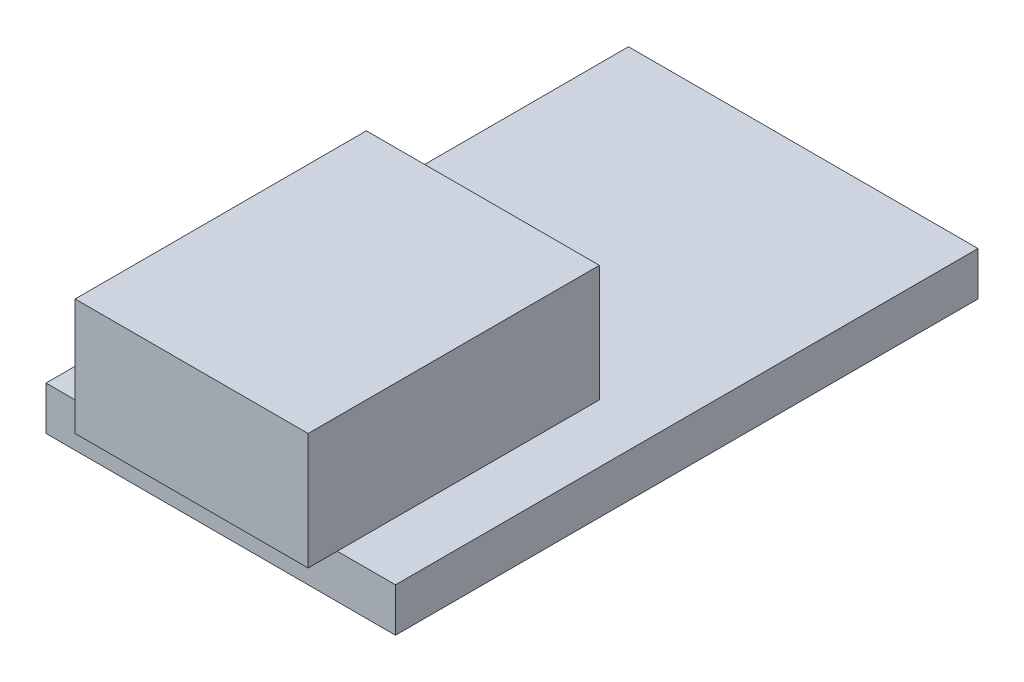
ISO-10303-21;
HEADER;
FILE_DESCRIPTION(('STEP AP214'),'2;1');
FILE_NAME('part.step','',(''),(''),'','','');
FILE_SCHEMA(('AUTOMOTIVE_DESIGN { 1 0 10303 214 1 1 1 1 }'));
ENDSEC;
DATA;
#1=APPLICATION_CONTEXT('core data for automotive mechanical design processes');
#2=APPLICATION_PROTOCOL_DEFINITION('international standard','automotive_design',2000,#1);
#3=PRODUCT_CONTEXT('',#1,'mechanical');
#4=PRODUCT('Part','Part','',(#3));
#5=PRODUCT_RELATED_PRODUCT_CATEGORY('part','',(#4));
#6=PRODUCT_DEFINITION_FORMATION('','',#4);
#7=PRODUCT_DEFINITION_CONTEXT('part definition',#1,'design');
#8=PRODUCT_DEFINITION('design','',#6,#7);
#9=PRODUCT_DEFINITION_SHAPE('','',#8);
#10=(LENGTH_UNIT() NAMED_UNIT(*) SI_UNIT(.MILLI.,.METRE.));
#11=(NAMED_UNIT(*) PLANE_ANGLE_UNIT() SI_UNIT($,.RADIAN.));
#12=(NAMED_UNIT(*) SI_UNIT($,.STERADIAN.) SOLID_ANGLE_UNIT());
#13=UNCERTAINTY_MEASURE_WITH_UNIT(LENGTH_MEASURE(1.E-05),#10,'distance_accuracy_value','');
#14=(GEOMETRIC_REPRESENTATION_CONTEXT(3) GLOBAL_UNCERTAINTY_ASSIGNED_CONTEXT((#13)) GLOBAL_UNIT_ASSIGNED_CONTEXT((#10,
#11,#12)) REPRESENTATION_CONTEXT('',''));
#15=CARTESIAN_POINT('',(0.,0.,0.));
#16=DIRECTION('',(0.,0.,1.));
#17=DIRECTION('',(1.,0.,0.));
#18=AXIS2_PLACEMENT_3D('',#15,#16,#17);
#19=CARTESIAN_POINT('',(4.,4.,5.));
#20=DIRECTION('',(-1.,0.,0.));
#21=DIRECTION('',(0.,0.,1.));
#22=AXIS2_PLACEMENT_3D('',#19,#20,#21);
#23=PLANE('',#22);
#24=DIRECTION('',(0.,0.,-1.));
#25=VECTOR('',#24,1.);
#26=CARTESIAN_POINT('',(4.,0.,5.));
#27=LINE('',#26,#25);
#28=CARTESIAN_POINT('',(4.,0.,5.));
#29=VERTEX_POINT('',#28);
#30=CARTESIAN_POINT('',(4.,0.,4.));
#31=VERTEX_POINT('',#30);
#32=EDGE_CURVE('E144',#29,#31,#27,.T.);
#33=ORIENTED_EDGE('',*,*,#32,.T.);
#34=CARTESIAN_POINT('',(4.,0.,-5.));
#35=VERTEX_POINT('',#34);
#36=EDGE_CURVE('E142',#31,#35,#27,.T.);
#37=ORIENTED_EDGE('',*,*,#36,.T.);
#38=DIRECTION('',(0.,-1.,0.));
#39=VECTOR('',#38,1.);
#40=CARTESIAN_POINT('',(4.,4.,-5.));
#41=LINE('',#40,#39);
#42=CARTESIAN_POINT('',(4.,4.,-5.));
#43=VERTEX_POINT('',#42);
#44=EDGE_CURVE('E36',#43,#35,#41,.T.);
#45=ORIENTED_EDGE('',*,*,#44,.F.);
#46=DIRECTION('',(0.,0.,-1.));
#47=VECTOR('',#46,1.);
#48=CARTESIAN_POINT('',(4.,4.,5.));
#49=LINE('',#48,#47);
#50=CARTESIAN_POINT('',(4.,4.,5.));
#51=VERTEX_POINT('',#50);
#52=EDGE_CURVE('E150',#51,#43,#49,.T.);
#53=ORIENTED_EDGE('',*,*,#52,.F.);
#54=DIRECTION('',(0.,-1.,0.));
#55=VECTOR('',#54,1.);
#56=CARTESIAN_POINT('',(4.,4.,5.));
#57=LINE('',#56,#55);
#58=EDGE_CURVE('E155',#51,#29,#57,.T.);
#59=ORIENTED_EDGE('',*,*,#58,.T.);
#60=EDGE_LOOP('',(#33,#37,#45,#53,#59));
#61=FACE_BOUND('',#60,.T.);
#62=ADVANCED_FACE('F33',(#61),#23,.F.);
#63=CARTESIAN_POINT('',(-4.,4.,-5.));
#64=DIRECTION('',(0.,0.,1.));
#65=DIRECTION('',(1.,0.,0.));
#66=AXIS2_PLACEMENT_3D('',#63,#64,#65);
#67=PLANE('',#66);
#68=DIRECTION('',(-1.,0.,0.));
#69=VECTOR('',#68,1.);
#70=CARTESIAN_POINT('',(-4.,0.,-5.));
#71=LINE('',#70,#69);
#72=CARTESIAN_POINT('',(-4.,0.,-5.));
#73=VERTEX_POINT('',#72);
#74=EDGE_CURVE('E157',#35,#73,#71,.T.);
#75=ORIENTED_EDGE('',*,*,#74,.T.);
#76=DIRECTION('',(0.,-1.,0.));
#77=VECTOR('',#76,1.);
#78=CARTESIAN_POINT('',(-4.,4.,-5.));
#79=LINE('',#78,#77);
#80=CARTESIAN_POINT('',(-4.,4.,-5.));
#81=VERTEX_POINT('',#80);
#82=EDGE_CURVE('E165',#81,#73,#79,.T.);
#83=ORIENTED_EDGE('',*,*,#82,.F.);
#84=DIRECTION('',(-1.,0.,0.));
#85=VECTOR('',#84,1.);
#86=CARTESIAN_POINT('',(-4.,4.,-5.));
#87=LINE('',#86,#85);
#88=EDGE_CURVE('E86',#43,#81,#87,.T.);
#89=ORIENTED_EDGE('',*,*,#88,.F.);
#90=ORIENTED_EDGE('',*,*,#44,.T.);
#91=EDGE_LOOP('',(#75,#83,#89,#90));
#92=FACE_BOUND('',#91,.T.);
#93=ADVANCED_FACE('F172',(#92),#67,.F.);
#94=CARTESIAN_POINT('',(-4.,4.,5.));
#95=DIRECTION('',(1.,0.,0.));
#96=DIRECTION('',(0.,0.,-1.));
#97=AXIS2_PLACEMENT_3D('',#94,#95,#96);
#98=PLANE('',#97);
#99=DIRECTION('',(0.,0.,1.));
#100=VECTOR('',#99,1.);
#101=CARTESIAN_POINT('',(-4.,0.,5.));
#102=LINE('',#101,#100);
#103=CARTESIAN_POINT('',(-4.,0.,4.));
#104=VERTEX_POINT('',#103);
#105=EDGE_CURVE('E160',#73,#104,#102,.T.);
#106=ORIENTED_EDGE('',*,*,#105,.T.);
#107=CARTESIAN_POINT('',(-4.,0.,5.));
#108=VERTEX_POINT('',#107);
#109=EDGE_CURVE('E159',#104,#108,#102,.T.);
#110=ORIENTED_EDGE('',*,*,#109,.T.);
#111=DIRECTION('',(0.,-1.,0.));
#112=VECTOR('',#111,1.);
#113=CARTESIAN_POINT('',(-4.,4.,5.));
#114=LINE('',#113,#112);
#115=CARTESIAN_POINT('',(-4.,4.,5.));
#116=VERTEX_POINT('',#115);
#117=EDGE_CURVE('E164',#116,#108,#114,.T.);
#118=ORIENTED_EDGE('',*,*,#117,.F.);
#119=DIRECTION('',(0.,0.,1.));
#120=VECTOR('',#119,1.);
#121=CARTESIAN_POINT('',(-4.,4.,5.));
#122=LINE('',#121,#120);
#123=EDGE_CURVE('E153',#81,#116,#122,.T.);
#124=ORIENTED_EDGE('',*,*,#123,.F.);
#125=ORIENTED_EDGE('',*,*,#82,.T.);
#126=EDGE_LOOP('',(#106,#110,#118,#124,#125));
#127=FACE_BOUND('',#126,.T.);
#128=ADVANCED_FACE('F180',(#127),#98,.F.);
#129=CARTESIAN_POINT('',(-4.,4.,5.));
#130=DIRECTION('',(0.,0.,-1.));
#131=DIRECTION('',(-1.,0.,0.));
#132=AXIS2_PLACEMENT_3D('',#129,#130,#131);
#133=PLANE('',#132);
#134=DIRECTION('',(1.,0.,0.));
#135=VECTOR('',#134,1.);
#136=CARTESIAN_POINT('',(-4.,0.,5.));
#137=LINE('',#136,#135);
#138=EDGE_CURVE('E78',#108,#29,#137,.T.);
#139=ORIENTED_EDGE('',*,*,#138,.T.);
#140=ORIENTED_EDGE('',*,*,#58,.F.);
#141=DIRECTION('',(1.,0.,0.));
#142=VECTOR('',#141,1.);
#143=CARTESIAN_POINT('',(-4.,4.,5.));
#144=LINE('',#143,#142);
#145=EDGE_CURVE('E57',#116,#51,#144,.T.);
#146=ORIENTED_EDGE('',*,*,#145,.F.);
#147=ORIENTED_EDGE('',*,*,#117,.T.);
#148=EDGE_LOOP('',(#139,#140,#146,#147));
#149=FACE_BOUND('',#148,.T.);
#150=ADVANCED_FACE('F183',(#149),#133,.F.);
#151=CARTESIAN_POINT('',(0.,4.,0.));
#152=DIRECTION('',(0.,-1.,0.));
#153=DIRECTION('',(0.,0.,-1.));
#154=AXIS2_PLACEMENT_3D('',#151,#152,#153);
#155=PLANE('',#154);
#156=ORIENTED_EDGE('',*,*,#52,.T.);
#157=ORIENTED_EDGE('',*,*,#88,.T.);
#158=ORIENTED_EDGE('',*,*,#123,.T.);
#159=ORIENTED_EDGE('',*,*,#145,.T.);
#160=EDGE_LOOP('',(#156,#157,#158,#159));
#161=FACE_BOUND('',#160,.T.);
#162=ADVANCED_FACE('F184',(#161),#155,.F.);
#163=CARTESIAN_POINT('',(0.,0.,0.));
#164=DIRECTION('',(0.,-1.,0.));
#165=DIRECTION('',(0.,0.,-1.));
#166=AXIS2_PLACEMENT_3D('',#163,#164,#165);
#167=PLANE('',#166);
#168=DIRECTION('',(-1.,0.,0.));
#169=VECTOR('',#168,1.);
#170=CARTESIAN_POINT('',(6.,0.,4.));
#171=LINE('',#170,#169);
#172=EDGE_CURVE('E11',#31,#104,#171,.T.);
#173=ORIENTED_EDGE('',*,*,#172,.F.);
#174=ORIENTED_EDGE('',*,*,#32,.F.);
#175=ORIENTED_EDGE('',*,*,#138,.F.);
#176=ORIENTED_EDGE('',*,*,#109,.F.);
#177=EDGE_LOOP('',(#173,#174,#175,#176));
#178=FACE_BOUND('',#177,.T.);
#179=ADVANCED_FACE('F182',(#178),#167,.T.);
#180=CARTESIAN_POINT('',(0.,0.,0.));
#181=DIRECTION('',(0.,1.,0.));
#182=DIRECTION('',(0.,0.,1.));
#183=AXIS2_PLACEMENT_3D('',#180,#181,#182);
#184=PLANE('',#183);
#185=ORIENTED_EDGE('',*,*,#36,.F.);
#186=CARTESIAN_POINT('',(6.,0.,4.));
#187=VERTEX_POINT('',#186);
#188=EDGE_CURVE('E42',#187,#31,#171,.T.);
#189=ORIENTED_EDGE('',*,*,#188,.F.);
#190=DIRECTION('',(0.,0.,1.));
#191=VECTOR('',#190,1.);
#192=CARTESIAN_POINT('',(6.,0.,4.));
#193=LINE('',#192,#191);
#194=CARTESIAN_POINT('',(6.,0.,-16.));
#195=VERTEX_POINT('',#194);
#196=EDGE_CURVE('E141',#195,#187,#193,.T.);
#197=ORIENTED_EDGE('',*,*,#196,.F.);
#198=DIRECTION('',(1.,0.,0.));
#199=VECTOR('',#198,1.);
#200=CARTESIAN_POINT('',(6.,0.,-16.));
#201=LINE('',#200,#199);
#202=CARTESIAN_POINT('',(-6.,0.,-16.));
#203=VERTEX_POINT('',#202);
#204=EDGE_CURVE('E137',#203,#195,#201,.T.);
#205=ORIENTED_EDGE('',*,*,#204,.F.);
#206=DIRECTION('',(0.,0.,-1.));
#207=VECTOR('',#206,1.);
#208=CARTESIAN_POINT('',(-6.,0.,4.));
#209=LINE('',#208,#207);
#210=CARTESIAN_POINT('',(-6.,0.,4.));
#211=VERTEX_POINT('',#210);
#212=EDGE_CURVE('E287',#211,#203,#209,.T.);
#213=ORIENTED_EDGE('',*,*,#212,.F.);
#214=EDGE_CURVE('E43',#104,#211,#171,.T.);
#215=ORIENTED_EDGE('',*,*,#214,.F.);
#216=ORIENTED_EDGE('',*,*,#105,.F.);
#217=ORIENTED_EDGE('',*,*,#74,.F.);
#218=EDGE_LOOP('',(#185,#189,#197,#205,#213,#215,#216,#217));
#219=FACE_BOUND('',#218,.T.);
#220=ADVANCED_FACE('F177',(#219),#184,.T.);
#221=CARTESIAN_POINT('',(6.,-1.5,4.));
#222=DIRECTION('',(-1.,0.,0.));
#223=DIRECTION('',(0.,0.,1.));
#224=AXIS2_PLACEMENT_3D('',#221,#222,#223);
#225=PLANE('',#224);
#226=ORIENTED_EDGE('',*,*,#196,.T.);
#227=DIRECTION('',(0.,1.,0.));
#228=VECTOR('',#227,1.);
#229=CARTESIAN_POINT('',(6.,-1.5,4.));
#230=LINE('',#229,#228);
#231=CARTESIAN_POINT('',(6.,-1.5,4.));
#232=VERTEX_POINT('',#231);
#233=EDGE_CURVE('E121',#232,#187,#230,.T.);
#234=ORIENTED_EDGE('',*,*,#233,.F.);
#235=DIRECTION('',(0.,0.,1.));
#236=VECTOR('',#235,1.);
#237=CARTESIAN_POINT('',(6.,-1.5,4.));
#238=LINE('',#237,#236);
#239=CARTESIAN_POINT('',(6.,-1.5,-16.));
#240=VERTEX_POINT('',#239);
#241=EDGE_CURVE('E128',#240,#232,#238,.T.);
#242=ORIENTED_EDGE('',*,*,#241,.F.);
#243=DIRECTION('',(0.,1.,0.));
#244=VECTOR('',#243,1.);
#245=CARTESIAN_POINT('',(6.,-1.5,-16.));
#246=LINE('',#245,#244);
#247=EDGE_CURVE('E285',#240,#195,#246,.T.);
#248=ORIENTED_EDGE('',*,*,#247,.T.);
#249=EDGE_LOOP('',(#226,#234,#242,#248));
#250=FACE_BOUND('',#249,.T.);
#251=ADVANCED_FACE('F139',(#250),#225,.F.);
#252=CARTESIAN_POINT('',(6.,-1.5,4.));
#253=DIRECTION('',(0.,0.,-1.));
#254=DIRECTION('',(-1.,0.,0.));
#255=AXIS2_PLACEMENT_3D('',#252,#253,#254);
#256=PLANE('',#255);
#257=ORIENTED_EDGE('',*,*,#188,.T.);
#258=ORIENTED_EDGE('',*,*,#172,.T.);
#259=ORIENTED_EDGE('',*,*,#214,.T.);
#260=DIRECTION('',(0.,1.,0.));
#261=VECTOR('',#260,1.);
#262=CARTESIAN_POINT('',(-6.,-1.5,4.));
#263=LINE('',#262,#261);
#264=CARTESIAN_POINT('',(-6.,-1.5,4.));
#265=VERTEX_POINT('',#264);
#266=EDGE_CURVE('E124',#265,#211,#263,.T.);
#267=ORIENTED_EDGE('',*,*,#266,.F.);
#268=DIRECTION('',(-1.,0.,0.));
#269=VECTOR('',#268,1.);
#270=CARTESIAN_POINT('',(6.,-1.5,4.));
#271=LINE('',#270,#269);
#272=EDGE_CURVE('E116',#232,#265,#271,.T.);
#273=ORIENTED_EDGE('',*,*,#272,.F.);
#274=ORIENTED_EDGE('',*,*,#233,.T.);
#275=EDGE_LOOP('',(#257,#258,#259,#267,#273,#274));
#276=FACE_BOUND('',#275,.T.);
#277=ADVANCED_FACE('F119',(#276),#256,.F.);
#278=CARTESIAN_POINT('',(-6.,-1.5,4.));
#279=DIRECTION('',(1.,0.,0.));
#280=DIRECTION('',(0.,0.,-1.));
#281=AXIS2_PLACEMENT_3D('',#278,#279,#280);
#282=PLANE('',#281);
#283=ORIENTED_EDGE('',*,*,#212,.T.);
#284=DIRECTION('',(0.,1.,0.));
#285=VECTOR('',#284,1.);
#286=CARTESIAN_POINT('',(-6.,-1.5,-16.));
#287=LINE('',#286,#285);
#288=CARTESIAN_POINT('',(-6.,-1.5,-16.));
#289=VERTEX_POINT('',#288);
#290=EDGE_CURVE('E146',#289,#203,#287,.T.);
#291=ORIENTED_EDGE('',*,*,#290,.F.);
#292=DIRECTION('',(0.,0.,-1.));
#293=VECTOR('',#292,1.);
#294=CARTESIAN_POINT('',(-6.,-1.5,4.));
#295=LINE('',#294,#293);
#296=EDGE_CURVE('E127',#265,#289,#295,.T.);
#297=ORIENTED_EDGE('',*,*,#296,.F.);
#298=ORIENTED_EDGE('',*,*,#266,.T.);
#299=EDGE_LOOP('',(#283,#291,#297,#298));
#300=FACE_BOUND('',#299,.T.);
#301=ADVANCED_FACE('F250',(#300),#282,.F.);
#302=CARTESIAN_POINT('',(6.,-1.5,-16.));
#303=DIRECTION('',(0.,0.,1.));
#304=DIRECTION('',(1.,0.,0.));
#305=AXIS2_PLACEMENT_3D('',#302,#303,#304);
#306=PLANE('',#305);
#307=ORIENTED_EDGE('',*,*,#204,.T.);
#308=ORIENTED_EDGE('',*,*,#247,.F.);
#309=DIRECTION('',(1.,0.,0.));
#310=VECTOR('',#309,1.);
#311=CARTESIAN_POINT('',(6.,-1.5,-16.));
#312=LINE('',#311,#310);
#313=EDGE_CURVE('E133',#289,#240,#312,.T.);
#314=ORIENTED_EDGE('',*,*,#313,.F.);
#315=ORIENTED_EDGE('',*,*,#290,.T.);
#316=EDGE_LOOP('',(#307,#308,#314,#315));
#317=FACE_BOUND('',#316,.T.);
#318=ADVANCED_FACE('F258',(#317),#306,.F.);
#319=CARTESIAN_POINT('',(0.,-1.5,0.));
#320=DIRECTION('',(0.,1.,0.));
#321=DIRECTION('',(0.,0.,1.));
#322=AXIS2_PLACEMENT_3D('',#319,#320,#321);
#323=PLANE('',#322);
#324=ORIENTED_EDGE('',*,*,#241,.T.);
#325=ORIENTED_EDGE('',*,*,#272,.T.);
#326=ORIENTED_EDGE('',*,*,#296,.T.);
#327=ORIENTED_EDGE('',*,*,#313,.T.);
#328=EDGE_LOOP('',(#324,#325,#326,#327));
#329=FACE_BOUND('',#328,.T.);
#330=ADVANCED_FACE('F131',(#329),#323,.F.);
#331=CLOSED_SHELL('',(#62,#93,#128,#150,#162,#179,#220,#251,#277,#301,#318,#330));
#332=MANIFOLD_SOLID_BREP('B2',#331);
#333=ADVANCED_BREP_SHAPE_REPRESENTATION('',(#18,#332),#14);
#334=SHAPE_DEFINITION_REPRESENTATION(#9,#333);
ENDSEC;
END-ISO-10303-21;
